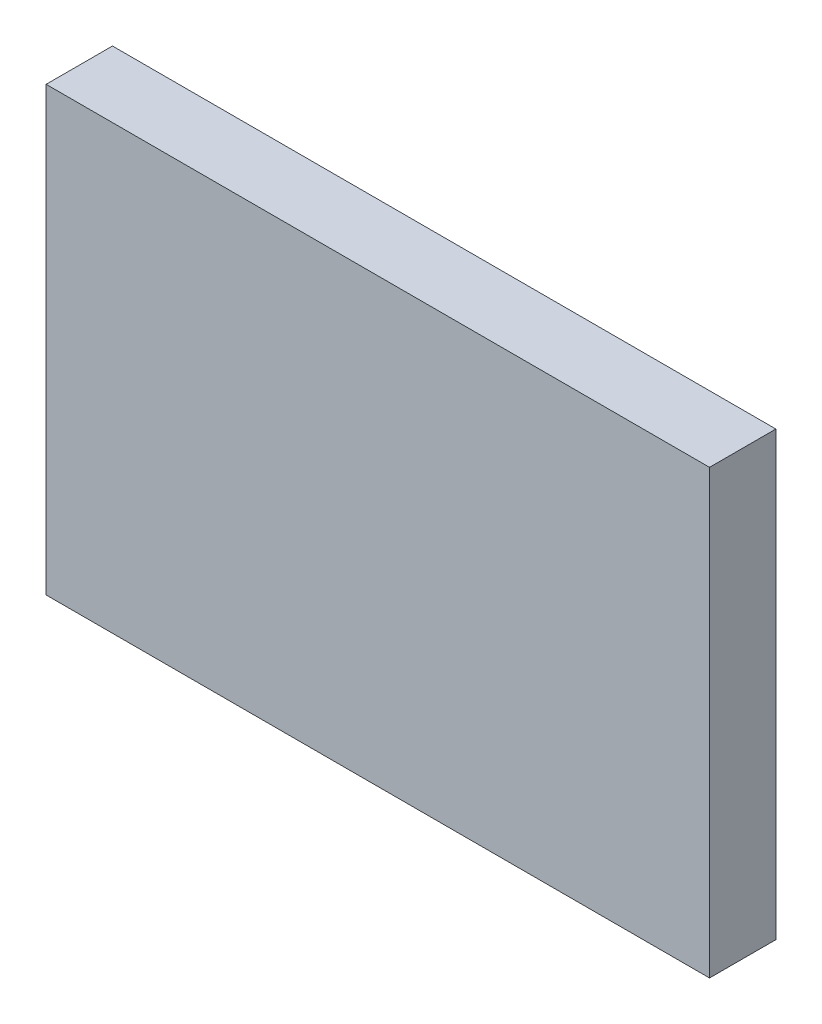
ISO-10303-21;
HEADER;
FILE_DESCRIPTION(('STEP AP214'),'2;1');
FILE_NAME('part.step','',(''),(''),'','','');
FILE_SCHEMA(('AUTOMOTIVE_DESIGN { 1 0 10303 214 1 1 1 1 }'));
ENDSEC;
DATA;
#1=APPLICATION_CONTEXT('core data for automotive mechanical design processes');
#2=APPLICATION_PROTOCOL_DEFINITION('international standard','automotive_design',2000,#1);
#3=PRODUCT_CONTEXT('',#1,'mechanical');
#4=PRODUCT('Part','Part','',(#3));
#5=PRODUCT_RELATED_PRODUCT_CATEGORY('part','',(#4));
#6=PRODUCT_DEFINITION_FORMATION('','',#4);
#7=PRODUCT_DEFINITION_CONTEXT('part definition',#1,'design');
#8=PRODUCT_DEFINITION('design','',#6,#7);
#9=PRODUCT_DEFINITION_SHAPE('','',#8);
#10=(LENGTH_UNIT() NAMED_UNIT(*) SI_UNIT(.MILLI.,.METRE.));
#11=(NAMED_UNIT(*) PLANE_ANGLE_UNIT() SI_UNIT($,.RADIAN.));
#12=(NAMED_UNIT(*) SI_UNIT($,.STERADIAN.) SOLID_ANGLE_UNIT());
#13=UNCERTAINTY_MEASURE_WITH_UNIT(LENGTH_MEASURE(1.E-05),#10,'distance_accuracy_value','');
#14=(GEOMETRIC_REPRESENTATION_CONTEXT(3) GLOBAL_UNCERTAINTY_ASSIGNED_CONTEXT((#13)) GLOBAL_UNIT_ASSIGNED_CONTEXT((#10,
#11,#12)) REPRESENTATION_CONTEXT('',''));
#15=CARTESIAN_POINT('',(0.,0.,0.));
#16=DIRECTION('',(0.,0.,1.));
#17=DIRECTION('',(1.,0.,0.));
#18=AXIS2_PLACEMENT_3D('',#15,#16,#17);
#19=CARTESIAN_POINT('',(0.,0.,12.));
#20=DIRECTION('',(0.,0.,1.));
#21=DIRECTION('',(1.,0.,0.));
#22=AXIS2_PLACEMENT_3D('',#19,#20,#21);
#23=PLANE('',#22);
#24=DIRECTION('',(1.,0.,0.));
#25=VECTOR('',#24,1.);
#26=CARTESIAN_POINT('',(-60.,-40.,12.));
#27=LINE('',#26,#25);
#28=CARTESIAN_POINT('',(-60.,-40.,12.));
#29=VERTEX_POINT('',#28);
#30=CARTESIAN_POINT('',(60.,-40.,12.));
#31=VERTEX_POINT('',#30);
#32=EDGE_CURVE('E84',#29,#31,#27,.T.);
#33=ORIENTED_EDGE('',*,*,#32,.T.);
#34=DIRECTION('',(0.,1.,0.));
#35=VECTOR('',#34,1.);
#36=CARTESIAN_POINT('',(60.,-40.,12.));
#37=LINE('',#36,#35);
#38=CARTESIAN_POINT('',(60.,40.,12.));
#39=VERTEX_POINT('',#38);
#40=EDGE_CURVE('E70',#31,#39,#37,.T.);
#41=ORIENTED_EDGE('',*,*,#40,.T.);
#42=DIRECTION('',(-1.,0.,0.));
#43=VECTOR('',#42,1.);
#44=CARTESIAN_POINT('',(60.,40.,12.));
#45=LINE('',#44,#43);
#46=CARTESIAN_POINT('',(-60.,40.,12.));
#47=VERTEX_POINT('',#46);
#48=EDGE_CURVE('E112',#39,#47,#45,.T.);
#49=ORIENTED_EDGE('',*,*,#48,.T.);
#50=DIRECTION('',(0.,-1.,0.));
#51=VECTOR('',#50,1.);
#52=CARTESIAN_POINT('',(-60.,40.,12.));
#53=LINE('',#52,#51);
#54=EDGE_CURVE('E10',#47,#29,#53,.T.);
#55=ORIENTED_EDGE('',*,*,#54,.T.);
#56=EDGE_LOOP('',(#33,#41,#49,#55));
#57=FACE_BOUND('',#56,.T.);
#58=ADVANCED_FACE('F16',(#57),#23,.T.);
#59=CARTESIAN_POINT('',(0.,0.,0.));
#60=DIRECTION('',(0.,0.,1.));
#61=DIRECTION('',(1.,0.,0.));
#62=AXIS2_PLACEMENT_3D('',#59,#60,#61);
#63=PLANE('',#62);
#64=DIRECTION('',(0.,-1.,0.));
#65=VECTOR('',#64,1.);
#66=CARTESIAN_POINT('',(-60.,40.,0.));
#67=LINE('',#66,#65);
#68=CARTESIAN_POINT('',(-60.,40.,0.));
#69=VERTEX_POINT('',#68);
#70=CARTESIAN_POINT('',(-60.,-40.,0.));
#71=VERTEX_POINT('',#70);
#72=EDGE_CURVE('E20',#69,#71,#67,.T.);
#73=ORIENTED_EDGE('',*,*,#72,.F.);
#74=DIRECTION('',(-1.,0.,0.));
#75=VECTOR('',#74,1.);
#76=CARTESIAN_POINT('',(60.,40.,0.));
#77=LINE('',#76,#75);
#78=CARTESIAN_POINT('',(60.,40.,0.));
#79=VERTEX_POINT('',#78);
#80=EDGE_CURVE('E81',#79,#69,#77,.T.);
#81=ORIENTED_EDGE('',*,*,#80,.F.);
#82=DIRECTION('',(0.,1.,0.));
#83=VECTOR('',#82,1.);
#84=CARTESIAN_POINT('',(60.,-40.,0.));
#85=LINE('',#84,#83);
#86=CARTESIAN_POINT('',(60.,-40.,0.));
#87=VERTEX_POINT('',#86);
#88=EDGE_CURVE('E100',#87,#79,#85,.T.);
#89=ORIENTED_EDGE('',*,*,#88,.F.);
#90=DIRECTION('',(1.,0.,0.));
#91=VECTOR('',#90,1.);
#92=CARTESIAN_POINT('',(-60.,-40.,0.));
#93=LINE('',#92,#91);
#94=EDGE_CURVE('E91',#71,#87,#93,.T.);
#95=ORIENTED_EDGE('',*,*,#94,.F.);
#96=EDGE_LOOP('',(#73,#81,#89,#95));
#97=FACE_BOUND('',#96,.T.);
#98=ADVANCED_FACE('F118',(#97),#63,.F.);
#99=CARTESIAN_POINT('',(-60.,40.,0.));
#100=DIRECTION('',(1.,0.,0.));
#101=DIRECTION('',(0.,1.,0.));
#102=AXIS2_PLACEMENT_3D('',#99,#100,#101);
#103=PLANE('',#102);
#104=ORIENTED_EDGE('',*,*,#72,.T.);
#105=DIRECTION('',(0.,0.,1.));
#106=VECTOR('',#105,1.);
#107=CARTESIAN_POINT('',(-60.,-40.,0.));
#108=LINE('',#107,#106);
#109=EDGE_CURVE('E88',#71,#29,#108,.T.);
#110=ORIENTED_EDGE('',*,*,#109,.T.);
#111=ORIENTED_EDGE('',*,*,#54,.F.);
#112=DIRECTION('',(0.,0.,1.));
#113=VECTOR('',#112,1.);
#114=CARTESIAN_POINT('',(-60.,40.,0.));
#115=LINE('',#114,#113);
#116=EDGE_CURVE('E108',#69,#47,#115,.T.);
#117=ORIENTED_EDGE('',*,*,#116,.F.);
#118=EDGE_LOOP('',(#104,#110,#111,#117));
#119=FACE_BOUND('',#118,.T.);
#120=ADVANCED_FACE('F18',(#119),#103,.F.);
#121=CARTESIAN_POINT('',(60.,40.,0.));
#122=DIRECTION('',(0.,-1.,0.));
#123=DIRECTION('',(0.,0.,-1.));
#124=AXIS2_PLACEMENT_3D('',#121,#122,#123);
#125=PLANE('',#124);
#126=ORIENTED_EDGE('',*,*,#80,.T.);
#127=ORIENTED_EDGE('',*,*,#116,.T.);
#128=ORIENTED_EDGE('',*,*,#48,.F.);
#129=DIRECTION('',(0.,0.,1.));
#130=VECTOR('',#129,1.);
#131=CARTESIAN_POINT('',(60.,40.,0.));
#132=LINE('',#131,#130);
#133=EDGE_CURVE('E78',#79,#39,#132,.T.);
#134=ORIENTED_EDGE('',*,*,#133,.F.);
#135=EDGE_LOOP('',(#126,#127,#128,#134));
#136=FACE_BOUND('',#135,.T.);
#137=ADVANCED_FACE('F120',(#136),#125,.F.);
#138=CARTESIAN_POINT('',(60.,-40.,0.));
#139=DIRECTION('',(-1.,0.,0.));
#140=DIRECTION('',(0.,0.,1.));
#141=AXIS2_PLACEMENT_3D('',#138,#139,#140);
#142=PLANE('',#141);
#143=ORIENTED_EDGE('',*,*,#88,.T.);
#144=ORIENTED_EDGE('',*,*,#133,.T.);
#145=ORIENTED_EDGE('',*,*,#40,.F.);
#146=DIRECTION('',(0.,0.,1.));
#147=VECTOR('',#146,1.);
#148=CARTESIAN_POINT('',(60.,-40.,0.));
#149=LINE('',#148,#147);
#150=EDGE_CURVE('E75',#87,#31,#149,.T.);
#151=ORIENTED_EDGE('',*,*,#150,.F.);
#152=EDGE_LOOP('',(#143,#144,#145,#151));
#153=FACE_BOUND('',#152,.T.);
#154=ADVANCED_FACE('F73',(#153),#142,.F.);
#155=CARTESIAN_POINT('',(-60.,-40.,0.));
#156=DIRECTION('',(0.,1.,0.));
#157=DIRECTION('',(1.,0.,0.));
#158=AXIS2_PLACEMENT_3D('',#155,#156,#157);
#159=PLANE('',#158);
#160=ORIENTED_EDGE('',*,*,#94,.T.);
#161=ORIENTED_EDGE('',*,*,#150,.T.);
#162=ORIENTED_EDGE('',*,*,#32,.F.);
#163=ORIENTED_EDGE('',*,*,#109,.F.);
#164=EDGE_LOOP('',(#160,#161,#162,#163));
#165=FACE_BOUND('',#164,.T.);
#166=ADVANCED_FACE('F90',(#165),#159,.F.);
#167=CLOSED_SHELL('',(#58,#98,#120,#137,#154,#166));
#168=MANIFOLD_SOLID_BREP('B1',#167);
#169=ADVANCED_BREP_SHAPE_REPRESENTATION('',(#18,#168),#14);
#170=SHAPE_DEFINITION_REPRESENTATION(#9,#169);
ENDSEC;
END-ISO-10303-21;
